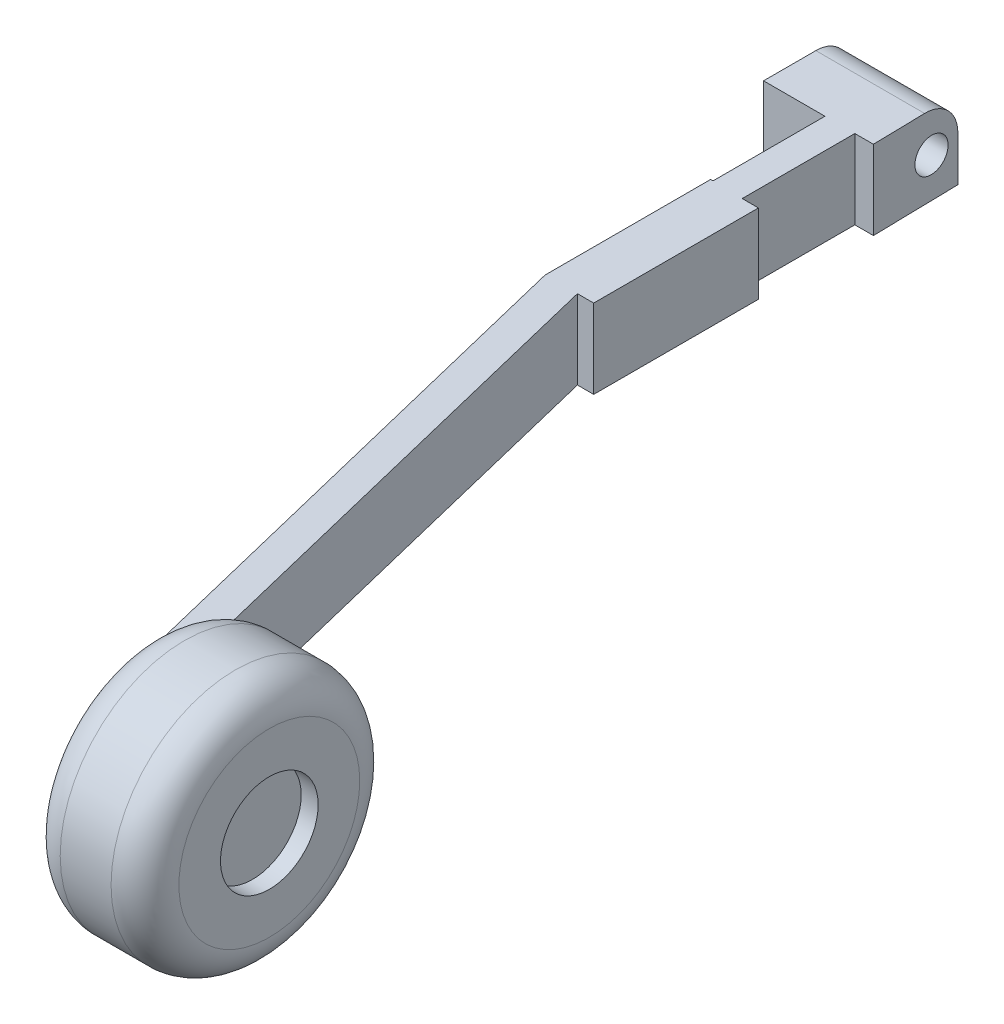
ISO-10303-21;
HEADER;
FILE_DESCRIPTION(('STEP AP214'),'2;1');
FILE_NAME('part.step','',(''),(''),'','','');
FILE_SCHEMA(('AUTOMOTIVE_DESIGN { 1 0 10303 214 1 1 1 1 }'));
ENDSEC;
DATA;
#1=APPLICATION_CONTEXT('core data for automotive mechanical design processes');
#2=APPLICATION_PROTOCOL_DEFINITION('international standard','automotive_design',2000,#1);
#3=PRODUCT_CONTEXT('',#1,'mechanical');
#4=PRODUCT('Part','Part','',(#3));
#5=PRODUCT_RELATED_PRODUCT_CATEGORY('part','',(#4));
#6=PRODUCT_DEFINITION_FORMATION('','',#4);
#7=PRODUCT_DEFINITION_CONTEXT('part definition',#1,'design');
#8=PRODUCT_DEFINITION('design','',#6,#7);
#9=PRODUCT_DEFINITION_SHAPE('','',#8);
#10=(LENGTH_UNIT() NAMED_UNIT(*) SI_UNIT(.MILLI.,.METRE.));
#11=(NAMED_UNIT(*) PLANE_ANGLE_UNIT() SI_UNIT($,.RADIAN.));
#12=(NAMED_UNIT(*) SI_UNIT($,.STERADIAN.) SOLID_ANGLE_UNIT());
#13=UNCERTAINTY_MEASURE_WITH_UNIT(LENGTH_MEASURE(1.E-05),#10,'distance_accuracy_value','');
#14=(GEOMETRIC_REPRESENTATION_CONTEXT(3) GLOBAL_UNCERTAINTY_ASSIGNED_CONTEXT((#13)) GLOBAL_UNIT_ASSIGNED_CONTEXT((#10,
#11,#12)) REPRESENTATION_CONTEXT('',''));
#15=CARTESIAN_POINT('',(0.,0.,0.));
#16=DIRECTION('',(0.,0.,1.));
#17=DIRECTION('',(1.,0.,0.));
#18=AXIS2_PLACEMENT_3D('',#15,#16,#17);
#19=CARTESIAN_POINT('',(-5.03694448897216,3.5,-80.374354469197));
#20=DIRECTION('',(0.,0.,-1.));
#21=DIRECTION('',(-1.,0.,0.));
#22=AXIS2_PLACEMENT_3D('',#19,#20,#21);
#23=PLANE('',#22);
#24=DIRECTION('',(1.,0.,0.));
#25=VECTOR('',#24,1.);
#26=CARTESIAN_POINT('',(-5.03694448897216,-3.5,-80.374354469197));
#27=LINE('',#26,#25);
#28=CARTESIAN_POINT('',(-6.67996169050031,-3.5,-80.374354469197));
#29=VERTEX_POINT('',#28);
#30=CARTESIAN_POINT('',(-5.03694448897216,-3.5,-80.374354469197));
#31=VERTEX_POINT('',#30);
#32=EDGE_CURVE('E352',#29,#31,#27,.T.);
#33=ORIENTED_EDGE('',*,*,#32,.T.);
#34=DIRECTION('',(0.,-1.,0.));
#35=VECTOR('',#34,1.);
#36=CARTESIAN_POINT('',(-5.03694448897216,3.5,-80.374354469197));
#37=LINE('',#36,#35);
#38=CARTESIAN_POINT('',(-5.03694448897216,3.5,-80.374354469197));
#39=VERTEX_POINT('',#38);
#40=EDGE_CURVE('E209',#39,#31,#37,.T.);
#41=ORIENTED_EDGE('',*,*,#40,.F.);
#42=DIRECTION('',(1.,0.,0.));
#43=VECTOR('',#42,1.);
#44=CARTESIAN_POINT('',(-5.03694448897216,3.5,-80.374354469197));
#45=LINE('',#44,#43);
#46=CARTESIAN_POINT('',(-6.67996169050031,3.5,-80.374354469197));
#47=VERTEX_POINT('',#46);
#48=EDGE_CURVE('E320',#47,#39,#45,.T.);
#49=ORIENTED_EDGE('',*,*,#48,.F.);
#50=DIRECTION('',(0.,-1.,0.));
#51=VECTOR('',#50,1.);
#52=CARTESIAN_POINT('',(-6.67996169050031,3.5,-80.374354469197));
#53=LINE('',#52,#51);
#54=EDGE_CURVE('E348',#47,#29,#53,.T.);
#55=ORIENTED_EDGE('',*,*,#54,.T.);
#56=EDGE_LOOP('',(#33,#41,#49,#55));
#57=FACE_BOUND('',#56,.T.);
#58=ADVANCED_FACE('F50',(#57),#23,.F.);
#59=CARTESIAN_POINT('',(-5.19609872614242,3.5,-88.));
#60=DIRECTION('',(-0.999782273478865,0.,0.020866375761781));
#61=DIRECTION('',(0.020866375761781,0.,0.999782273478865));
#62=AXIS2_PLACEMENT_3D('',#59,#60,#61);
#63=PLANE('',#62);
#64=CARTESIAN_POINT('',(-5.14645807417686,0.,-85.6215398186203));
#65=DIRECTION('',(-0.999782273478865,0.,0.020866375761781));
#66=DIRECTION('',(-0.020866375761781,0.,-0.999782273478865));
#67=AXIS2_PLACEMENT_3D('',#64,#65,#66);
#68=ELLIPSE('',#67,1.50032666090444,1.5);
#69=CARTESIAN_POINT('',(-5.17776445404871,0.,-87.1215398186203));
#70=VERTEX_POINT('',#69);
#71=EDGE_CURVE('E354',#70,#70,#68,.T.);
#72=ORIENTED_EDGE('',*,*,#71,.T.);
#73=EDGE_LOOP('',(#72));
#74=FACE_BOUND('',#73,.T.);
#75=DIRECTION('',(0.,-1.,0.));
#76=VECTOR('',#75,1.);
#77=CARTESIAN_POINT('',(-5.19609872614242,3.5,-88.));
#78=LINE('',#77,#76);
#79=CARTESIAN_POINT('',(-5.19609872614242,0.5,-88.));
#80=VERTEX_POINT('',#79);
#81=CARTESIAN_POINT('',(-5.19609872614242,-3.5,-88.));
#82=VERTEX_POINT('',#81);
#83=EDGE_CURVE('E215',#80,#82,#78,.T.);
#84=ORIENTED_EDGE('',*,*,#83,.F.);
#85=CARTESIAN_POINT('',(-5.13348596639872,0.5,-85.));
#86=DIRECTION('',(-0.999782273478865,0.,0.020866375761781));
#87=DIRECTION('',(0.020866375761781,0.,0.999782273478865));
#88=AXIS2_PLACEMENT_3D('',#85,#86,#87);
#89=ELLIPSE('',#88,3.00065332180889,3.);
#90=CARTESIAN_POINT('',(-5.13348596639872,3.5,-85.));
#91=VERTEX_POINT('',#90);
#92=EDGE_CURVE('E250',#80,#91,#89,.F.);
#93=ORIENTED_EDGE('',*,*,#92,.T.);
#94=DIRECTION('',(-0.020866375761781,0.,-0.999782273478865));
#95=VECTOR('',#94,1.);
#96=CARTESIAN_POINT('',(-5.19609872614242,3.5,-88.));
#97=LINE('',#96,#95);
#98=EDGE_CURVE('E311',#39,#91,#97,.T.);
#99=ORIENTED_EDGE('',*,*,#98,.F.);
#100=ORIENTED_EDGE('',*,*,#40,.T.);
#101=DIRECTION('',(-0.020866375761781,0.,-0.999782273478865));
#102=VECTOR('',#101,1.);
#103=CARTESIAN_POINT('',(-5.19609872614242,-3.5,-88.));
#104=LINE('',#103,#102);
#105=EDGE_CURVE('E353',#31,#82,#104,.T.);
#106=ORIENTED_EDGE('',*,*,#105,.T.);
#107=EDGE_LOOP('',(#84,#93,#99,#100,#106));
#108=FACE_BOUND('',#107,.T.);
#109=ADVANCED_FACE('F288',(#74,#108),#63,.F.);
#110=CARTESIAN_POINT('',(-5.19609872614242,3.5,-88.));
#111=DIRECTION('',(0.,0.,1.));
#112=DIRECTION('',(1.,0.,0.));
#113=AXIS2_PLACEMENT_3D('',#110,#111,#112);
#114=PLANE('',#113);
#115=DIRECTION('',(0.,-1.,0.));
#116=VECTOR('',#115,1.);
#117=CARTESIAN_POINT('',(-14.7557379934769,3.5,-88.));
#118=LINE('',#117,#116);
#119=CARTESIAN_POINT('',(-14.7557379934769,0.5,-88.));
#120=VERTEX_POINT('',#119);
#121=CARTESIAN_POINT('',(-14.7557379934769,-3.5,-88.));
#122=VERTEX_POINT('',#121);
#123=EDGE_CURVE('E213',#120,#122,#118,.T.);
#124=ORIENTED_EDGE('',*,*,#123,.F.);
#125=DIRECTION('',(-1.,0.,0.));
#126=VECTOR('',#125,1.);
#127=CARTESIAN_POINT('',(-5.19609872614242,0.5,-88.));
#128=LINE('',#127,#126);
#129=EDGE_CURVE('E64',#120,#80,#128,.F.);
#130=ORIENTED_EDGE('',*,*,#129,.T.);
#131=ORIENTED_EDGE('',*,*,#83,.T.);
#132=DIRECTION('',(-1.,0.,0.));
#133=VECTOR('',#132,1.);
#134=CARTESIAN_POINT('',(-5.19609872614242,-3.5,-88.));
#135=LINE('',#134,#133);
#136=EDGE_CURVE('E358',#82,#122,#135,.T.);
#137=ORIENTED_EDGE('',*,*,#136,.T.);
#138=EDGE_LOOP('',(#124,#130,#131,#137));
#139=FACE_BOUND('',#138,.T.);
#140=ADVANCED_FACE('F294',(#139),#114,.F.);
#141=CARTESIAN_POINT('',(-14.7557379934769,3.5,-88.));
#142=DIRECTION('',(1.,0.,0.));
#143=DIRECTION('',(0.,0.,-1.));
#144=AXIS2_PLACEMENT_3D('',#141,#142,#143);
#145=PLANE('',#144);
#146=CARTESIAN_POINT('',(-14.7557379934769,0.,-85.6215398186203));
#147=DIRECTION('',(-1.,0.,0.));
#148=DIRECTION('',(0.,0.,1.));
#149=AXIS2_PLACEMENT_3D('',#146,#147,#148);
#150=CIRCLE('',#149,1.5);
#151=CARTESIAN_POINT('',(-14.7557379934769,0.,-84.1215398186203));
#152=VERTEX_POINT('',#151);
#153=EDGE_CURVE('E198',#152,#152,#150,.T.);
#154=ORIENTED_EDGE('',*,*,#153,.F.);
#155=EDGE_LOOP('',(#154));
#156=FACE_BOUND('',#155,.T.);
#157=DIRECTION('',(0.,0.,1.));
#158=VECTOR('',#157,1.);
#159=CARTESIAN_POINT('',(-14.7557379934769,3.5,-88.));
#160=LINE('',#159,#158);
#161=CARTESIAN_POINT('',(-14.7557379934769,3.5,-85.));
#162=VERTEX_POINT('',#161);
#163=CARTESIAN_POINT('',(-14.7557379934769,3.5,-80.374354469197));
#164=VERTEX_POINT('',#163);
#165=EDGE_CURVE('E316',#162,#164,#160,.T.);
#166=ORIENTED_EDGE('',*,*,#165,.F.);
#167=CARTESIAN_POINT('',(-14.7557379934769,0.5,-85.));
#168=DIRECTION('',(1.,0.,0.));
#169=DIRECTION('',(0.,0.,-1.));
#170=AXIS2_PLACEMENT_3D('',#167,#168,#169);
#171=CIRCLE('',#170,3.);
#172=EDGE_CURVE('E68',#162,#120,#171,.F.);
#173=ORIENTED_EDGE('',*,*,#172,.T.);
#174=ORIENTED_EDGE('',*,*,#123,.T.);
#175=DIRECTION('',(0.,0.,1.));
#176=VECTOR('',#175,1.);
#177=CARTESIAN_POINT('',(-14.7557379934769,-3.5,-88.));
#178=LINE('',#177,#176);
#179=CARTESIAN_POINT('',(-14.7557379934769,-3.5,-80.374354469197));
#180=VERTEX_POINT('',#179);
#181=EDGE_CURVE('E360',#122,#180,#178,.T.);
#182=ORIENTED_EDGE('',*,*,#181,.T.);
#183=DIRECTION('',(0.,-1.,0.));
#184=VECTOR('',#183,1.);
#185=CARTESIAN_POINT('',(-14.7557379934769,3.5,-80.374354469197));
#186=LINE('',#185,#184);
#187=EDGE_CURVE('E219',#164,#180,#186,.T.);
#188=ORIENTED_EDGE('',*,*,#187,.F.);
#189=EDGE_LOOP('',(#166,#173,#174,#182,#188));
#190=FACE_BOUND('',#189,.T.);
#191=ADVANCED_FACE('F446',(#156,#190),#145,.F.);
#192=CARTESIAN_POINT('',(-14.7557379934769,3.5,-80.374354469197));
#193=DIRECTION('',(0.,0.,-1.));
#194=DIRECTION('',(-1.,0.,0.));
#195=AXIS2_PLACEMENT_3D('',#192,#193,#194);
#196=PLANE('',#195);
#197=DIRECTION('',(1.,0.,0.));
#198=VECTOR('',#197,1.);
#199=CARTESIAN_POINT('',(-14.7557379934769,-3.5,-80.374354469197));
#200=LINE('',#199,#198);
#201=CARTESIAN_POINT('',(-9.32515265076594,-3.5,-80.374354469197));
#202=VERTEX_POINT('',#201);
#203=EDGE_CURVE('E363',#180,#202,#200,.T.);
#204=ORIENTED_EDGE('',*,*,#203,.T.);
#205=DIRECTION('',(0.,-1.,0.));
#206=VECTOR('',#205,1.);
#207=CARTESIAN_POINT('',(-9.32515265076594,3.5,-80.374354469197));
#208=LINE('',#207,#206);
#209=CARTESIAN_POINT('',(-9.32515265076594,3.5,-80.374354469197));
#210=VERTEX_POINT('',#209);
#211=EDGE_CURVE('E218',#210,#202,#208,.T.);
#212=ORIENTED_EDGE('',*,*,#211,.F.);
#213=DIRECTION('',(1.,0.,0.));
#214=VECTOR('',#213,1.);
#215=CARTESIAN_POINT('',(-14.7557379934769,3.5,-80.374354469197));
#216=LINE('',#215,#214);
#217=EDGE_CURVE('E322',#164,#210,#216,.T.);
#218=ORIENTED_EDGE('',*,*,#217,.F.);
#219=ORIENTED_EDGE('',*,*,#187,.T.);
#220=EDGE_LOOP('',(#204,#212,#218,#219));
#221=FACE_BOUND('',#220,.T.);
#222=ADVANCED_FACE('F444',(#221),#196,.F.);
#223=CARTESIAN_POINT('',(-9.32515265076594,3.5,-80.374354469197));
#224=DIRECTION('',(1.,0.,0.));
#225=DIRECTION('',(0.,0.,-1.));
#226=AXIS2_PLACEMENT_3D('',#223,#224,#225);
#227=PLANE('',#226);
#228=DIRECTION('',(0.,0.,1.));
#229=VECTOR('',#228,1.);
#230=CARTESIAN_POINT('',(-9.32515265076594,-3.5,-80.374354469197));
#231=LINE('',#230,#229);
#232=CARTESIAN_POINT('',(-9.32515265076594,-3.5,-70.4741867122559));
#233=VERTEX_POINT('',#232);
#234=EDGE_CURVE('E361',#202,#233,#231,.T.);
#235=ORIENTED_EDGE('',*,*,#234,.T.);
#236=DIRECTION('',(0.,-1.,0.));
#237=VECTOR('',#236,1.);
#238=CARTESIAN_POINT('',(-9.32515265076594,3.5,-70.4741867122559));
#239=LINE('',#238,#237);
#240=CARTESIAN_POINT('',(-9.32515265076594,3.5,-70.4741867122559));
#241=VERTEX_POINT('',#240);
#242=EDGE_CURVE('E223',#241,#233,#239,.T.);
#243=ORIENTED_EDGE('',*,*,#242,.F.);
#244=DIRECTION('',(0.,0.,1.));
#245=VECTOR('',#244,1.);
#246=CARTESIAN_POINT('',(-9.32515265076594,3.5,-80.374354469197));
#247=LINE('',#246,#245);
#248=EDGE_CURVE('E330',#210,#241,#247,.T.);
#249=ORIENTED_EDGE('',*,*,#248,.F.);
#250=ORIENTED_EDGE('',*,*,#211,.T.);
#251=EDGE_LOOP('',(#235,#243,#249,#250));
#252=FACE_BOUND('',#251,.T.);
#253=ADVANCED_FACE('F441',(#252),#227,.F.);
#254=CARTESIAN_POINT('',(-9.32515265076594,3.5,-70.4741867122559));
#255=DIRECTION('',(0.,0.,1.));
#256=DIRECTION('',(1.,0.,0.));
#257=AXIS2_PLACEMENT_3D('',#254,#255,#256);
#258=PLANE('',#257);
#259=DIRECTION('',(-1.,0.,0.));
#260=VECTOR('',#259,1.);
#261=CARTESIAN_POINT('',(-9.32515265076594,-3.5,-70.4741867122559));
#262=LINE('',#261,#260);
#263=CARTESIAN_POINT('',(-9.53942248269727,-3.5,-70.4741867122559));
#264=VERTEX_POINT('',#263);
#265=EDGE_CURVE('E362',#233,#264,#262,.T.);
#266=ORIENTED_EDGE('',*,*,#265,.T.);
#267=DIRECTION('',(0.,-1.,0.));
#268=VECTOR('',#267,1.);
#269=CARTESIAN_POINT('',(-9.53942248269727,3.5,-70.4741867122559));
#270=LINE('',#269,#268);
#271=CARTESIAN_POINT('',(-9.53942248269727,3.5,-70.4741867122559));
#272=VERTEX_POINT('',#271);
#273=EDGE_CURVE('E228',#272,#264,#270,.T.);
#274=ORIENTED_EDGE('',*,*,#273,.F.);
#275=DIRECTION('',(-1.,0.,0.));
#276=VECTOR('',#275,1.);
#277=CARTESIAN_POINT('',(-9.32515265076594,3.5,-70.4741867122559));
#278=LINE('',#277,#276);
#279=EDGE_CURVE('E328',#241,#272,#278,.T.);
#280=ORIENTED_EDGE('',*,*,#279,.F.);
#281=ORIENTED_EDGE('',*,*,#242,.T.);
#282=EDGE_LOOP('',(#266,#274,#280,#281));
#283=FACE_BOUND('',#282,.T.);
#284=ADVANCED_FACE('F436',(#283),#258,.F.);
#285=CARTESIAN_POINT('',(-9.53942248269727,3.5,-70.4741867122559));
#286=DIRECTION('',(1.,0.,0.));
#287=DIRECTION('',(0.,0.,-1.));
#288=AXIS2_PLACEMENT_3D('',#285,#286,#287);
#289=PLANE('',#288);
#290=DIRECTION('',(0.,0.,1.));
#291=VECTOR('',#290,1.);
#292=CARTESIAN_POINT('',(-9.53942248269727,-3.5,-70.4741867122559));
#293=LINE('',#292,#291);
#294=CARTESIAN_POINT('',(-9.53942248269727,-3.5,-55.8322077648098));
#295=VERTEX_POINT('',#294);
#296=EDGE_CURVE('E370',#264,#295,#293,.T.);
#297=ORIENTED_EDGE('',*,*,#296,.T.);
#298=DIRECTION('',(0.,-1.,0.));
#299=VECTOR('',#298,1.);
#300=CARTESIAN_POINT('',(-9.53942248269727,3.5,-55.8322077648098));
#301=LINE('',#300,#299);
#302=CARTESIAN_POINT('',(-9.53942248269727,3.5,-55.8322077648098));
#303=VERTEX_POINT('',#302);
#304=EDGE_CURVE('E230',#303,#295,#301,.T.);
#305=ORIENTED_EDGE('',*,*,#304,.F.);
#306=DIRECTION('',(0.,0.,1.));
#307=VECTOR('',#306,1.);
#308=CARTESIAN_POINT('',(-9.53942248269727,3.5,-70.4741867122559));
#309=LINE('',#308,#307);
#310=EDGE_CURVE('E335',#272,#303,#309,.T.);
#311=ORIENTED_EDGE('',*,*,#310,.F.);
#312=ORIENTED_EDGE('',*,*,#273,.T.);
#313=EDGE_LOOP('',(#297,#305,#311,#312));
#314=FACE_BOUND('',#313,.T.);
#315=ADVANCED_FACE('F427',(#314),#289,.F.);
#316=CARTESIAN_POINT('',(-9.53942248269727,3.5,-55.8322077648098));
#317=DIRECTION('',(0.971512276313056,0.,-0.236989233875772));
#318=DIRECTION('',(-0.236989233875772,0.,-0.971512276313056));
#319=AXIS2_PLACEMENT_3D('',#316,#317,#318);
#320=PLANE('',#319);
#321=DIRECTION('',(0.236989233875772,0.,0.971512276313055));
#322=VECTOR('',#321,1.);
#323=CARTESIAN_POINT('',(-9.53942248269727,-3.5,-55.8322077648098));
#324=LINE('',#323,#322);
#325=CARTESIAN_POINT('',(3.52532052370275,-3.5,-2.27467685922398));
#326=VERTEX_POINT('',#325);
#327=EDGE_CURVE('E367',#295,#326,#324,.T.);
#328=ORIENTED_EDGE('',*,*,#327,.T.);
#329=DIRECTION('',(0.,-1.,0.));
#330=VECTOR('',#329,1.);
#331=CARTESIAN_POINT('',(3.52532052370275,3.5,-2.27467685922398));
#332=LINE('',#331,#330);
#333=CARTESIAN_POINT('',(3.52532052370275,3.5,-2.27467685922398));
#334=VERTEX_POINT('',#333);
#335=EDGE_CURVE('E235',#334,#326,#332,.T.);
#336=ORIENTED_EDGE('',*,*,#335,.F.);
#337=DIRECTION('',(0.236989233875772,0.,0.971512276313055));
#338=VECTOR('',#337,1.);
#339=CARTESIAN_POINT('',(-9.53942248269727,3.5,-55.8322077648098));
#340=LINE('',#339,#338);
#341=EDGE_CURVE('E334',#303,#334,#340,.T.);
#342=ORIENTED_EDGE('',*,*,#341,.F.);
#343=ORIENTED_EDGE('',*,*,#304,.T.);
#344=EDGE_LOOP('',(#328,#336,#342,#343));
#345=FACE_BOUND('',#344,.T.);
#346=ADVANCED_FACE('F428',(#345),#320,.F.);
#347=CARTESIAN_POINT('',(3.52532052370275,3.5,-2.27467685922398));
#348=DIRECTION('',(0.,0.,-1.));
#349=DIRECTION('',(-1.,0.,0.));
#350=AXIS2_PLACEMENT_3D('',#347,#348,#349);
#351=PLANE('',#350);
#352=DIRECTION('',(1.,0.,0.));
#353=VECTOR('',#352,1.);
#354=CARTESIAN_POINT('',(3.52532052370275,-3.5,-2.27467685922398));
#355=LINE('',#354,#353);
#356=CARTESIAN_POINT('',(5.50913882304363,-3.5,-2.27467685922398));
#357=VERTEX_POINT('',#356);
#358=EDGE_CURVE('E371',#326,#357,#355,.T.);
#359=ORIENTED_EDGE('',*,*,#358,.T.);
#360=DIRECTION('',(0.,-1.,0.));
#361=VECTOR('',#360,1.);
#362=CARTESIAN_POINT('',(5.50913882304363,3.5,-2.27467685922398));
#363=LINE('',#362,#361);
#364=CARTESIAN_POINT('',(5.50913882304363,3.5,-2.27467685922398));
#365=VERTEX_POINT('',#364);
#366=EDGE_CURVE('E232',#365,#357,#363,.T.);
#367=ORIENTED_EDGE('',*,*,#366,.F.);
#368=DIRECTION('',(1.,0.,0.));
#369=VECTOR('',#368,1.);
#370=CARTESIAN_POINT('',(3.52532052370275,3.5,-2.27467685922398));
#371=LINE('',#370,#369);
#372=EDGE_CURVE('E337',#334,#365,#371,.T.);
#373=ORIENTED_EDGE('',*,*,#372,.F.);
#374=ORIENTED_EDGE('',*,*,#335,.T.);
#375=EDGE_LOOP('',(#359,#367,#373,#374));
#376=FACE_BOUND('',#375,.T.);
#377=ADVANCED_FACE('F422',(#376),#351,.F.);
#378=CARTESIAN_POINT('',(5.50913882304363,3.5,-2.27467685922398));
#379=DIRECTION('',(-1.,0.,0.));
#380=DIRECTION('',(0.,0.,1.));
#381=AXIS2_PLACEMENT_3D('',#378,#379,#380);
#382=PLANE('',#381);
#383=CARTESIAN_POINT('',(5.50913882304363,0.,-4.38483986057706));
#384=DIRECTION('',(1.,0.,0.));
#385=DIRECTION('',(0.,0.,-1.));
#386=AXIS2_PLACEMENT_3D('',#383,#384,#385);
#387=CIRCLE('',#386,1.5);
#388=CARTESIAN_POINT('',(5.50913882304363,0.0682143307115985,-5.88328799284109));
#389=VERTEX_POINT('',#388);
#390=CARTESIAN_POINT('',(5.50913882304363,-0.0682143307115985,-5.88328799284109));
#391=VERTEX_POINT('',#390);
#392=EDGE_CURVE('E189',#389,#391,#387,.T.);
#393=ORIENTED_EDGE('',*,*,#392,.F.);
#394=DIRECTION('',(0.,-1.,0.));
#395=VECTOR('',#394,1.);
#396=CARTESIAN_POINT('',(5.50913882304363,3.5,-5.88328799284109));
#397=LINE('',#396,#395);
#398=CARTESIAN_POINT('',(5.50913882304363,3.5,-5.88328799284109));
#399=VERTEX_POINT('',#398);
#400=EDGE_CURVE('E179',#399,#389,#397,.T.);
#401=ORIENTED_EDGE('',*,*,#400,.F.);
#402=DIRECTION('',(0.,0.,-1.));
#403=VECTOR('',#402,1.);
#404=CARTESIAN_POINT('',(5.50913882304363,3.5,-2.27467685922398));
#405=LINE('',#404,#403);
#406=EDGE_CURVE('E336',#365,#399,#405,.T.);
#407=ORIENTED_EDGE('',*,*,#406,.F.);
#408=ORIENTED_EDGE('',*,*,#366,.T.);
#409=DIRECTION('',(0.,0.,-1.));
#410=VECTOR('',#409,1.);
#411=CARTESIAN_POINT('',(5.50913882304363,-3.5,-2.27467685922398));
#412=LINE('',#411,#410);
#413=CARTESIAN_POINT('',(5.50913882304363,-3.5,-5.88328799284109));
#414=VERTEX_POINT('',#413);
#415=EDGE_CURVE('E192',#357,#414,#412,.T.);
#416=ORIENTED_EDGE('',*,*,#415,.T.);
#417=EDGE_CURVE('E176',#391,#414,#397,.T.);
#418=ORIENTED_EDGE('',*,*,#417,.F.);
#419=EDGE_LOOP('',(#393,#401,#407,#408,#416,#418));
#420=FACE_BOUND('',#419,.T.);
#421=ADVANCED_FACE('F190',(#420),#382,.F.);
#422=CARTESIAN_POINT('',(5.50913882304363,3.5,-5.88328799284109));
#423=DIRECTION('',(-0.971491509419261,0.,0.237074349363835));
#424=DIRECTION('',(0.237074349363835,0.,0.971491509419261));
#425=AXIS2_PLACEMENT_3D('',#422,#423,#424);
#426=PLANE('',#425);
#427=DIRECTION('',(-0.237074349363835,0.,-0.971491509419261));
#428=VECTOR('',#427,1.);
#429=CARTESIAN_POINT('',(5.50913882304363,-3.5,-5.88328799284109));
#430=LINE('',#429,#428);
#431=CARTESIAN_POINT('',(-6.67996169050031,-3.5,-55.8322077648098));
#432=VERTEX_POINT('',#431);
#433=EDGE_CURVE('E372',#414,#432,#430,.T.);
#434=ORIENTED_EDGE('',*,*,#433,.T.);
#435=DIRECTION('',(0.,-1.,0.));
#436=VECTOR('',#435,1.);
#437=CARTESIAN_POINT('',(-6.67996169050031,3.5,-55.8322077648098));
#438=LINE('',#437,#436);
#439=CARTESIAN_POINT('',(-6.67996169050031,3.5,-55.8322077648098));
#440=VERTEX_POINT('',#439);
#441=EDGE_CURVE('E195',#440,#432,#438,.T.);
#442=ORIENTED_EDGE('',*,*,#441,.F.);
#443=DIRECTION('',(-0.237074349363835,0.,-0.971491509419261));
#444=VECTOR('',#443,1.);
#445=CARTESIAN_POINT('',(5.50913882304363,3.5,-5.88328799284109));
#446=LINE('',#445,#444);
#447=EDGE_CURVE('E338',#399,#440,#446,.T.);
#448=ORIENTED_EDGE('',*,*,#447,.F.);
#449=ORIENTED_EDGE('',*,*,#400,.T.);
#450=CARTESIAN_POINT('',(5.50913882304363,0.0682143307115983,-5.88328799284109));
#451=DIRECTION('',(0.,-1.,0.));
#452=VECTOR('',#451,1.);
#453=LINE('',#450,#452);
#454=EDGE_CURVE('E175',#389,#391,#453,.T.);
#455=ORIENTED_EDGE('',*,*,#454,.T.);
#456=ORIENTED_EDGE('',*,*,#417,.T.);
#457=EDGE_LOOP('',(#434,#442,#448,#449,#455,#456));
#458=FACE_BOUND('',#457,.T.);
#459=ADVANCED_FACE('F174',(#458),#426,.F.);
#460=CARTESIAN_POINT('',(-6.67996169050031,3.5,-55.8322077648098));
#461=DIRECTION('',(0.,0.,-1.));
#462=DIRECTION('',(-1.,0.,0.));
#463=AXIS2_PLACEMENT_3D('',#460,#461,#462);
#464=PLANE('',#463);
#465=DIRECTION('',(1.,0.,0.));
#466=VECTOR('',#465,1.);
#467=CARTESIAN_POINT('',(-6.67996169050031,-3.5,-55.8322077648098));
#468=LINE('',#467,#466);
#469=CARTESIAN_POINT('',(-5.24184346317062,-3.5,-55.8322077648098));
#470=VERTEX_POINT('',#469);
#471=EDGE_CURVE('E376',#432,#470,#468,.T.);
#472=ORIENTED_EDGE('',*,*,#471,.T.);
#473=DIRECTION('',(0.,-1.,0.));
#474=VECTOR('',#473,1.);
#475=CARTESIAN_POINT('',(-5.24184346317062,3.5,-55.8322077648098));
#476=LINE('',#475,#474);
#477=CARTESIAN_POINT('',(-5.24184346317062,3.5,-55.8322077648098));
#478=VERTEX_POINT('',#477);
#479=EDGE_CURVE('E392',#478,#470,#476,.T.);
#480=ORIENTED_EDGE('',*,*,#479,.F.);
#481=DIRECTION('',(1.,0.,0.));
#482=VECTOR('',#481,1.);
#483=CARTESIAN_POINT('',(-6.67996169050031,3.5,-55.8322077648098));
#484=LINE('',#483,#482);
#485=EDGE_CURVE('E344',#440,#478,#484,.T.);
#486=ORIENTED_EDGE('',*,*,#485,.F.);
#487=ORIENTED_EDGE('',*,*,#441,.T.);
#488=EDGE_LOOP('',(#472,#480,#486,#487));
#489=FACE_BOUND('',#488,.T.);
#490=ADVANCED_FACE('F405',(#489),#464,.F.);
#491=CARTESIAN_POINT('',(-5.24184346317062,3.5,-70.4073019499872));
#492=DIRECTION('',(-1.,0.,0.));
#493=DIRECTION('',(0.,0.,1.));
#494=AXIS2_PLACEMENT_3D('',#491,#492,#493);
#495=PLANE('',#494);
#496=DIRECTION('',(0.,0.,-1.));
#497=VECTOR('',#496,1.);
#498=CARTESIAN_POINT('',(-5.24184346317062,-3.5,-70.4073019499872));
#499=LINE('',#498,#497);
#500=CARTESIAN_POINT('',(-5.24184346317062,-3.5,-70.4073019499872));
#501=VERTEX_POINT('',#500);
#502=EDGE_CURVE('E377',#470,#501,#499,.T.);
#503=ORIENTED_EDGE('',*,*,#502,.T.);
#504=DIRECTION('',(0.,-1.,0.));
#505=VECTOR('',#504,1.);
#506=CARTESIAN_POINT('',(-5.24184346317062,3.5,-70.4073019499872));
#507=LINE('',#506,#505);
#508=CARTESIAN_POINT('',(-5.24184346317062,3.5,-70.4073019499872));
#509=VERTEX_POINT('',#508);
#510=EDGE_CURVE('E386',#509,#501,#507,.T.);
#511=ORIENTED_EDGE('',*,*,#510,.F.);
#512=DIRECTION('',(0.,0.,-1.));
#513=VECTOR('',#512,1.);
#514=CARTESIAN_POINT('',(-5.24184346317062,3.5,-70.4073019499872));
#515=LINE('',#514,#513);
#516=EDGE_CURVE('E341',#478,#509,#515,.T.);
#517=ORIENTED_EDGE('',*,*,#516,.F.);
#518=ORIENTED_EDGE('',*,*,#479,.T.);
#519=EDGE_LOOP('',(#503,#511,#517,#518));
#520=FACE_BOUND('',#519,.T.);
#521=ADVANCED_FACE('F410',(#520),#495,.F.);
#522=CARTESIAN_POINT('',(-6.67996169050031,3.5,-70.4073019499872));
#523=DIRECTION('',(0.,0.,1.));
#524=DIRECTION('',(1.,0.,0.));
#525=AXIS2_PLACEMENT_3D('',#522,#523,#524);
#526=PLANE('',#525);
#527=DIRECTION('',(-1.,0.,0.));
#528=VECTOR('',#527,1.);
#529=CARTESIAN_POINT('',(-6.67996169050031,-3.5,-70.4073019499872));
#530=LINE('',#529,#528);
#531=CARTESIAN_POINT('',(-6.67996169050031,-3.5,-70.4073019499872));
#532=VERTEX_POINT('',#531);
#533=EDGE_CURVE('E379',#501,#532,#530,.T.);
#534=ORIENTED_EDGE('',*,*,#533,.T.);
#535=DIRECTION('',(0.,-1.,0.));
#536=VECTOR('',#535,1.);
#537=CARTESIAN_POINT('',(-6.67996169050031,3.5,-70.4073019499872));
#538=LINE('',#537,#536);
#539=CARTESIAN_POINT('',(-6.67996169050031,3.5,-70.4073019499872));
#540=VERTEX_POINT('',#539);
#541=EDGE_CURVE('E387',#540,#532,#538,.T.);
#542=ORIENTED_EDGE('',*,*,#541,.F.);
#543=DIRECTION('',(-1.,0.,0.));
#544=VECTOR('',#543,1.);
#545=CARTESIAN_POINT('',(-6.67996169050031,3.5,-70.4073019499872));
#546=LINE('',#545,#544);
#547=EDGE_CURVE('E347',#509,#540,#546,.T.);
#548=ORIENTED_EDGE('',*,*,#547,.F.);
#549=ORIENTED_EDGE('',*,*,#510,.T.);
#550=EDGE_LOOP('',(#534,#542,#548,#549));
#551=FACE_BOUND('',#550,.T.);
#552=ADVANCED_FACE('F412',(#551),#526,.F.);
#553=CARTESIAN_POINT('',(-6.67996169050031,3.5,-80.374354469197));
#554=DIRECTION('',(-1.,0.,0.));
#555=DIRECTION('',(0.,0.,1.));
#556=AXIS2_PLACEMENT_3D('',#553,#554,#555);
#557=PLANE('',#556);
#558=DIRECTION('',(0.,0.,-1.));
#559=VECTOR('',#558,1.);
#560=CARTESIAN_POINT('',(-6.67996169050031,-3.5,-80.374354469197));
#561=LINE('',#560,#559);
#562=EDGE_CURVE('E325',#532,#29,#561,.T.);
#563=ORIENTED_EDGE('',*,*,#562,.T.);
#564=ORIENTED_EDGE('',*,*,#54,.F.);
#565=DIRECTION('',(0.,0.,-1.));
#566=VECTOR('',#565,1.);
#567=CARTESIAN_POINT('',(-6.67996169050031,3.5,-72.0144753034867));
#568=LINE('',#567,#566);
#569=EDGE_CURVE('E350',#540,#47,#568,.T.);
#570=ORIENTED_EDGE('',*,*,#569,.F.);
#571=ORIENTED_EDGE('',*,*,#541,.T.);
#572=EDGE_LOOP('',(#563,#564,#570,#571));
#573=FACE_BOUND('',#572,.T.);
#574=ADVANCED_FACE('F452',(#573),#557,.F.);
#575=CARTESIAN_POINT('',(0.,3.5,0.));
#576=DIRECTION('',(0.,1.,0.));
#577=DIRECTION('',(0.,0.,1.));
#578=AXIS2_PLACEMENT_3D('',#575,#576,#577);
#579=PLANE('',#578);
#580=ORIENTED_EDGE('',*,*,#98,.T.);
#581=DIRECTION('',(-1.,0.,0.));
#582=VECTOR('',#581,1.);
#583=CARTESIAN_POINT('',(-14.7557379934769,3.5,-85.));
#584=LINE('',#583,#582);
#585=EDGE_CURVE('E214',#91,#162,#584,.T.);
#586=ORIENTED_EDGE('',*,*,#585,.T.);
#587=ORIENTED_EDGE('',*,*,#165,.T.);
#588=ORIENTED_EDGE('',*,*,#217,.T.);
#589=ORIENTED_EDGE('',*,*,#248,.T.);
#590=ORIENTED_EDGE('',*,*,#279,.T.);
#591=ORIENTED_EDGE('',*,*,#310,.T.);
#592=ORIENTED_EDGE('',*,*,#341,.T.);
#593=ORIENTED_EDGE('',*,*,#372,.T.);
#594=ORIENTED_EDGE('',*,*,#406,.T.);
#595=ORIENTED_EDGE('',*,*,#447,.T.);
#596=ORIENTED_EDGE('',*,*,#485,.T.);
#597=ORIENTED_EDGE('',*,*,#516,.T.);
#598=ORIENTED_EDGE('',*,*,#547,.T.);
#599=ORIENTED_EDGE('',*,*,#569,.T.);
#600=ORIENTED_EDGE('',*,*,#48,.T.);
#601=EDGE_LOOP('',(#580,#586,#587,#588,#589,#590,#591,#592,#593,#594,#595,#596,#597,#598,#599,#600));
#602=FACE_BOUND('',#601,.T.);
#603=ADVANCED_FACE('F314',(#602),#579,.T.);
#604=CARTESIAN_POINT('',(0.,-3.5,0.));
#605=DIRECTION('',(0.,1.,0.));
#606=DIRECTION('',(0.,0.,1.));
#607=AXIS2_PLACEMENT_3D('',#604,#605,#606);
#608=PLANE('',#607);
#609=ORIENTED_EDGE('',*,*,#32,.F.);
#610=ORIENTED_EDGE('',*,*,#562,.F.);
#611=ORIENTED_EDGE('',*,*,#533,.F.);
#612=ORIENTED_EDGE('',*,*,#502,.F.);
#613=ORIENTED_EDGE('',*,*,#471,.F.);
#614=ORIENTED_EDGE('',*,*,#433,.F.);
#615=ORIENTED_EDGE('',*,*,#415,.F.);
#616=ORIENTED_EDGE('',*,*,#358,.F.);
#617=ORIENTED_EDGE('',*,*,#327,.F.);
#618=ORIENTED_EDGE('',*,*,#296,.F.);
#619=ORIENTED_EDGE('',*,*,#265,.F.);
#620=ORIENTED_EDGE('',*,*,#234,.F.);
#621=ORIENTED_EDGE('',*,*,#203,.F.);
#622=ORIENTED_EDGE('',*,*,#181,.F.);
#623=ORIENTED_EDGE('',*,*,#136,.F.);
#624=ORIENTED_EDGE('',*,*,#105,.F.);
#625=EDGE_LOOP('',(#609,#610,#611,#612,#613,#614,#615,#616,#617,#618,#619,#620,#621,#622,#623,#624));
#626=FACE_BOUND('',#625,.T.);
#627=ADVANCED_FACE('F403',(#626),#608,.F.);
#628=CARTESIAN_POINT('',(12.2442620065231,0.,-85.6215398186203));
#629=DIRECTION('',(-1.,0.,0.));
#630=DIRECTION('',(0.,0.,1.));
#631=AXIS2_PLACEMENT_3D('',#628,#629,#630);
#632=CYLINDRICAL_SURFACE('',#631,1.5);
#633=ORIENTED_EDGE('',*,*,#153,.T.);
#634=EDGE_LOOP('',(#633));
#635=FACE_BOUND('',#634,.T.);
#636=ORIENTED_EDGE('',*,*,#71,.F.);
#637=EDGE_LOOP('',(#636));
#638=FACE_BOUND('',#637,.T.);
#639=ADVANCED_FACE('F522',(#635,#638),#632,.F.);
#640=CARTESIAN_POINT('',(7.00913882304364,0.,-4.38483986057706));
#641=DIRECTION('',(-1.,0.,0.));
#642=DIRECTION('',(0.,0.,1.));
#643=AXIS2_PLACEMENT_3D('',#640,#641,#642);
#644=CYLINDRICAL_SURFACE('',#643,1.5);
#645=CARTESIAN_POINT('',(7.00913882304364,0.,-4.38483986057706));
#646=DIRECTION('',(1.,0.,0.));
#647=DIRECTION('',(0.,0.,-1.));
#648=AXIS2_PLACEMENT_3D('',#645,#646,#647);
#649=CIRCLE('',#648,1.5);
#650=CARTESIAN_POINT('',(7.00913882304364,0.,-5.88483986057706));
#651=VERTEX_POINT('',#650);
#652=EDGE_CURVE('E197',#651,#651,#649,.T.);
#653=ORIENTED_EDGE('',*,*,#652,.F.);
#654=EDGE_LOOP('',(#653));
#655=FACE_BOUND('',#654,.T.);
#656=ORIENTED_EDGE('',*,*,#392,.T.);
#657=ORIENTED_EDGE('',*,*,#454,.F.);
#658=EDGE_LOOP('',(#656,#657));
#659=FACE_BOUND('',#658,.T.);
#660=ADVANCED_FACE('F193',(#655,#659),#644,.T.);
#661=CARTESIAN_POINT('',(17.5091388230436,0.,-4.38483986057706));
#662=DIRECTION('',(-1.,0.,0.));
#663=DIRECTION('',(0.,0.,1.));
#664=AXIS2_PLACEMENT_3D('',#661,#662,#663);
#665=CYLINDRICAL_SURFACE('',#664,11.);
#666=CARTESIAN_POINT('',(10.0091388230436,0.,-4.38483986057706));
#667=DIRECTION('',(1.,0.,0.));
#668=DIRECTION('',(0.,0.,-1.));
#669=AXIS2_PLACEMENT_3D('',#666,#667,#668);
#670=CIRCLE('',#669,11.);
#671=CARTESIAN_POINT('',(10.0091388230436,0.,-15.3848398605771));
#672=VERTEX_POINT('',#671);
#673=EDGE_CURVE('E255',#672,#672,#670,.T.);
#674=ORIENTED_EDGE('',*,*,#673,.T.);
#675=EDGE_LOOP('',(#674));
#676=FACE_BOUND('',#675,.T.);
#677=CARTESIAN_POINT('',(14.5091388230437,0.,-4.38483986057706));
#678=DIRECTION('',(1.,0.,0.));
#679=DIRECTION('',(0.,0.,-1.));
#680=AXIS2_PLACEMENT_3D('',#677,#678,#679);
#681=CIRCLE('',#680,11.);
#682=CARTESIAN_POINT('',(14.5091388230437,0.,-15.3848398605771));
#683=VERTEX_POINT('',#682);
#684=EDGE_CURVE('E248',#683,#683,#681,.F.);
#685=ORIENTED_EDGE('',*,*,#684,.T.);
#686=EDGE_LOOP('',(#685));
#687=FACE_BOUND('',#686,.T.);
#688=ADVANCED_FACE('F267',(#676,#687),#665,.T.);
#689=CARTESIAN_POINT('',(17.5091388230436,0.,-4.38483986057706));
#690=DIRECTION('',(1.,0.,0.));
#691=DIRECTION('',(0.,0.,-1.));
#692=AXIS2_PLACEMENT_3D('',#689,#690,#691);
#693=PLANE('',#692);
#694=CARTESIAN_POINT('',(17.5091388230436,0.,-4.38483986057706));
#695=DIRECTION('',(1.,0.,0.));
#696=DIRECTION('',(0.,0.,-1.));
#697=AXIS2_PLACEMENT_3D('',#694,#695,#696);
#698=CIRCLE('',#697,4.31867217009246);
#699=CARTESIAN_POINT('',(17.5091388230436,0.,-8.70351203066952));
#700=VERTEX_POINT('',#699);
#701=EDGE_CURVE('E203',#700,#700,#698,.T.);
#702=ORIENTED_EDGE('',*,*,#701,.F.);
#703=EDGE_LOOP('',(#702));
#704=FACE_BOUND('',#703,.T.);
#705=CARTESIAN_POINT('',(17.5091388230436,0.,-4.38483986057706));
#706=DIRECTION('',(1.,0.,0.));
#707=DIRECTION('',(0.,0.,-1.));
#708=AXIS2_PLACEMENT_3D('',#705,#706,#707);
#709=CIRCLE('',#708,8.);
#710=CARTESIAN_POINT('',(17.5091388230436,0.,-12.3848398605771));
#711=VERTEX_POINT('',#710);
#712=EDGE_CURVE('E11',#711,#711,#709,.T.);
#713=ORIENTED_EDGE('',*,*,#712,.T.);
#714=EDGE_LOOP('',(#713));
#715=FACE_BOUND('',#714,.T.);
#716=ADVANCED_FACE('F269',(#704,#715),#693,.T.);
#717=CARTESIAN_POINT('',(7.00913882304364,0.,-4.38483986057706));
#718=DIRECTION('',(1.,0.,0.));
#719=DIRECTION('',(0.,0.,-1.));
#720=AXIS2_PLACEMENT_3D('',#717,#718,#719);
#721=PLANE('',#720);
#722=CARTESIAN_POINT('',(7.00913882304364,0.,-4.38483986057706));
#723=DIRECTION('',(1.,0.,0.));
#724=DIRECTION('',(0.,0.,-1.));
#725=AXIS2_PLACEMENT_3D('',#722,#723,#724);
#726=CIRCLE('',#725,8.);
#727=CARTESIAN_POINT('',(7.00913882304364,0.,-12.3848398605771));
#728=VERTEX_POINT('',#727);
#729=EDGE_CURVE('E54',#728,#728,#726,.F.);
#730=ORIENTED_EDGE('',*,*,#729,.T.);
#731=EDGE_LOOP('',(#730));
#732=FACE_BOUND('',#731,.T.);
#733=ORIENTED_EDGE('',*,*,#652,.T.);
#734=EDGE_LOOP('',(#733));
#735=FACE_BOUND('',#734,.T.);
#736=ADVANCED_FACE('F259',(#732,#735),#721,.F.);
#737=CARTESIAN_POINT('',(0.,0.5,-85.));
#738=DIRECTION('',(1.,0.,0.));
#739=DIRECTION('',(0.,0.,-1.));
#740=AXIS2_PLACEMENT_3D('',#737,#738,#739);
#741=CYLINDRICAL_SURFACE('',#740,3.);
#742=ORIENTED_EDGE('',*,*,#92,.F.);
#743=ORIENTED_EDGE('',*,*,#129,.F.);
#744=ORIENTED_EDGE('',*,*,#172,.F.);
#745=ORIENTED_EDGE('',*,*,#585,.F.);
#746=EDGE_LOOP('',(#742,#743,#744,#745));
#747=FACE_BOUND('',#746,.T.);
#748=ADVANCED_FACE('F265',(#747),#741,.T.);
#749=CARTESIAN_POINT('',(10.0091388230436,0.,-4.38483986057706));
#750=DIRECTION('',(1.,0.,0.));
#751=DIRECTION('',(0.,0.,-1.));
#752=AXIS2_PLACEMENT_3D('',#749,#750,#751);
#753=TOROIDAL_SURFACE('',#752,8.,3.);
#754=ORIENTED_EDGE('',*,*,#729,.F.);
#755=EDGE_LOOP('',(#754));
#756=FACE_BOUND('',#755,.T.);
#757=ORIENTED_EDGE('',*,*,#673,.F.);
#758=EDGE_LOOP('',(#757));
#759=FACE_BOUND('',#758,.T.);
#760=ADVANCED_FACE('F258',(#756,#759),#753,.T.);
#761=CARTESIAN_POINT('',(14.5091388230437,0.,-4.38483986057706));
#762=DIRECTION('',(1.,0.,0.));
#763=DIRECTION('',(0.,0.,-1.));
#764=AXIS2_PLACEMENT_3D('',#761,#762,#763);
#765=TOROIDAL_SURFACE('',#764,8.,3.);
#766=ORIENTED_EDGE('',*,*,#684,.F.);
#767=EDGE_LOOP('',(#766));
#768=FACE_BOUND('',#767,.T.);
#769=ORIENTED_EDGE('',*,*,#712,.F.);
#770=EDGE_LOOP('',(#769));
#771=FACE_BOUND('',#770,.T.);
#772=ADVANCED_FACE('F47',(#768,#771),#765,.T.);
#773=CARTESIAN_POINT('',(16.0091388230436,0.,-4.38483986057706));
#774=DIRECTION('',(1.,0.,0.));
#775=DIRECTION('',(0.,0.,-1.));
#776=AXIS2_PLACEMENT_3D('',#773,#774,#775);
#777=CYLINDRICAL_SURFACE('',#776,4.31867217009246);
#778=CARTESIAN_POINT('',(16.0091388230436,0.,-4.38483986057706));
#779=DIRECTION('',(1.,0.,0.));
#780=DIRECTION('',(0.,0.,-1.));
#781=AXIS2_PLACEMENT_3D('',#778,#779,#780);
#782=CIRCLE('',#781,4.31867217009246);
#783=CARTESIAN_POINT('',(16.0091388230436,0.,-8.70351203066952));
#784=VERTEX_POINT('',#783);
#785=EDGE_CURVE('E199',#784,#784,#782,.T.);
#786=ORIENTED_EDGE('',*,*,#785,.F.);
#787=EDGE_LOOP('',(#786));
#788=FACE_BOUND('',#787,.T.);
#789=ORIENTED_EDGE('',*,*,#701,.T.);
#790=EDGE_LOOP('',(#789));
#791=FACE_BOUND('',#790,.T.);
#792=ADVANCED_FACE('F273',(#788,#791),#777,.F.);
#793=CARTESIAN_POINT('',(16.0091388230436,0.,-4.38483986057706));
#794=DIRECTION('',(1.,0.,0.));
#795=DIRECTION('',(0.,0.,-1.));
#796=AXIS2_PLACEMENT_3D('',#793,#794,#795);
#797=PLANE('',#796);
#798=ORIENTED_EDGE('',*,*,#785,.T.);
#799=EDGE_LOOP('',(#798));
#800=FACE_BOUND('',#799,.T.);
#801=ADVANCED_FACE('F586',(#800),#797,.T.);
#802=CLOSED_SHELL('',(#58,#109,#140,#191,#222,#253,#284,#315,#346,#377,#421,#459,#490,#521,#552,
#574,#603,#627,#639,#660,#688,#716,#736,#748,#760,#772,#792,#801));
#803=MANIFOLD_SOLID_BREP('B2',#802);
#804=ADVANCED_BREP_SHAPE_REPRESENTATION('',(#18,#803),#14);
#805=SHAPE_DEFINITION_REPRESENTATION(#9,#804);
ENDSEC;
END-ISO-10303-21;
